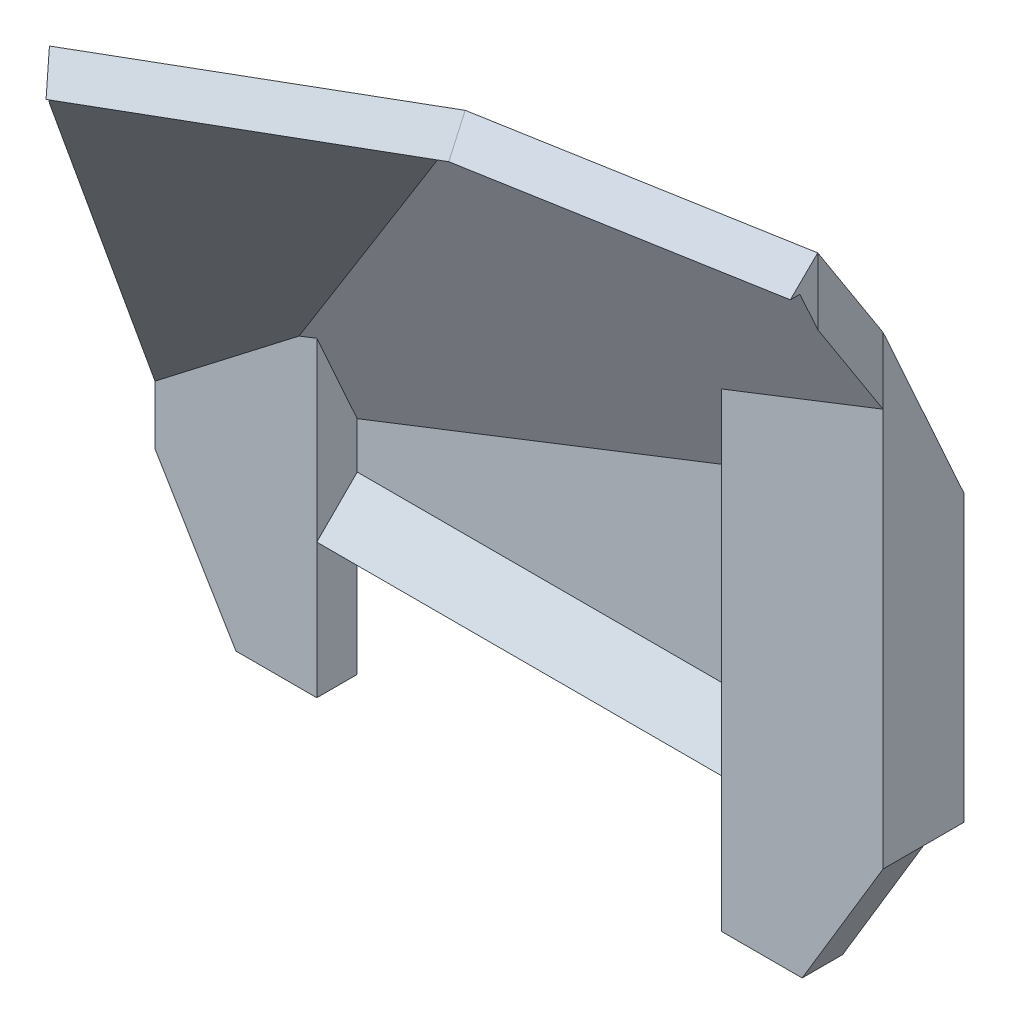
ISO-10303-21;
HEADER;
FILE_DESCRIPTION(('STEP AP214'),'2;1');
FILE_NAME('part.step','',(''),(''),'','','');
FILE_SCHEMA(('AUTOMOTIVE_DESIGN { 1 0 10303 214 1 1 1 1 }'));
ENDSEC;
DATA;
#1=APPLICATION_CONTEXT('core data for automotive mechanical design processes');
#2=APPLICATION_PROTOCOL_DEFINITION('international standard','automotive_design',2000,#1);
#3=PRODUCT_CONTEXT('',#1,'mechanical');
#4=PRODUCT('Part','Part','',(#3));
#5=PRODUCT_RELATED_PRODUCT_CATEGORY('part','',(#4));
#6=PRODUCT_DEFINITION_FORMATION('','',#4);
#7=PRODUCT_DEFINITION_CONTEXT('part definition',#1,'design');
#8=PRODUCT_DEFINITION('design','',#6,#7);
#9=PRODUCT_DEFINITION_SHAPE('','',#8);
#10=(LENGTH_UNIT() NAMED_UNIT(*) SI_UNIT(.MILLI.,.METRE.));
#11=(NAMED_UNIT(*) PLANE_ANGLE_UNIT() SI_UNIT($,.RADIAN.));
#12=(NAMED_UNIT(*) SI_UNIT($,.STERADIAN.) SOLID_ANGLE_UNIT());
#13=UNCERTAINTY_MEASURE_WITH_UNIT(LENGTH_MEASURE(1.E-05),#10,'distance_accuracy_value','');
#14=(GEOMETRIC_REPRESENTATION_CONTEXT(3) GLOBAL_UNCERTAINTY_ASSIGNED_CONTEXT((#13)) GLOBAL_UNIT_ASSIGNED_CONTEXT((#10,
#11,#12)) REPRESENTATION_CONTEXT('',''));
#15=CARTESIAN_POINT('',(0.,0.,0.));
#16=DIRECTION('',(0.,0.,1.));
#17=DIRECTION('',(1.,0.,0.));
#18=AXIS2_PLACEMENT_3D('',#15,#16,#17);
#19=CARTESIAN_POINT('',(-26.9999999999999,-10.,6.));
#20=DIRECTION('',(0.,0.,-1.));
#21=DIRECTION('',(1.,0.,0.));
#22=AXIS2_PLACEMENT_3D('',#19,#20,#21);
#23=PLANE('',#22);
#24=DIRECTION('',(0.,1.,0.));
#25=VECTOR('',#24,1.);
#26=CARTESIAN_POINT('',(-14.9999999999999,-10.,6.));
#27=LINE('',#26,#25);
#28=CARTESIAN_POINT('',(-14.9999999999999,-10.,6.));
#29=VERTEX_POINT('',#28);
#30=CARTESIAN_POINT('',(-14.9999999999999,0.,6.));
#31=VERTEX_POINT('',#30);
#32=EDGE_CURVE('E231',#29,#31,#27,.T.);
#33=ORIENTED_EDGE('',*,*,#32,.T.);
#34=CARTESIAN_POINT('',(-14.9999999999999,13.0901132346419,6.));
#35=VERTEX_POINT('',#34);
#36=EDGE_CURVE('E69',#31,#35,#27,.T.);
#37=ORIENTED_EDGE('',*,*,#36,.T.);
#38=DIRECTION('',(-0.931153923421058,-0.364626344217709,0.));
#39=VECTOR('',#38,1.);
#40=CARTESIAN_POINT('',(-16.267360264084,12.5938333734112,6.));
#41=LINE('',#40,#39);
#42=CARTESIAN_POINT('',(-16.3187220339688,12.5737208507503,6.));
#43=VERTEX_POINT('',#42);
#44=EDGE_CURVE('E223',#35,#43,#41,.T.);
#45=ORIENTED_EDGE('',*,*,#44,.T.);
#46=DIRECTION('',(-0.791909036541971,-0.610639073302034,0.));
#47=VECTOR('',#46,1.);
#48=CARTESIAN_POINT('',(-9.75365482953572,17.6360277179458,6.));
#49=LINE('',#48,#47);
#50=CARTESIAN_POINT('',(-26.9999999999999,4.33741418181764,6.));
#51=VERTEX_POINT('',#50);
#52=EDGE_CURVE('E220',#43,#51,#49,.T.);
#53=ORIENTED_EDGE('',*,*,#52,.T.);
#54=DIRECTION('',(0.,1.,0.));
#55=VECTOR('',#54,1.);
#56=CARTESIAN_POINT('',(-26.9999999999999,-10.,6.));
#57=LINE('',#56,#55);
#58=CARTESIAN_POINT('',(-26.9999999999999,0.,6.));
#59=VERTEX_POINT('',#58);
#60=EDGE_CURVE('E235',#59,#51,#57,.T.);
#61=ORIENTED_EDGE('',*,*,#60,.F.);
#62=DIRECTION('',(0.514495755427529,-0.857492925712543,0.));
#63=VECTOR('',#62,1.);
#64=CARTESIAN_POINT('',(-20.9999999999999,-10.,6.));
#65=LINE('',#64,#63);
#66=CARTESIAN_POINT('',(-20.9999999999999,-10.,6.));
#67=VERTEX_POINT('',#66);
#68=EDGE_CURVE('E381',#59,#67,#65,.T.);
#69=ORIENTED_EDGE('',*,*,#68,.T.);
#70=DIRECTION('',(1.,0.,0.));
#71=VECTOR('',#70,1.);
#72=CARTESIAN_POINT('',(-26.9999999999999,-10.,6.));
#73=LINE('',#72,#71);
#74=EDGE_CURVE('E194',#67,#29,#73,.T.);
#75=ORIENTED_EDGE('',*,*,#74,.T.);
#76=EDGE_LOOP('',(#33,#37,#45,#53,#61,#69,#75));
#77=FACE_BOUND('',#76,.T.);
#78=ADVANCED_FACE('F48',(#77),#23,.F.);
#79=CARTESIAN_POINT('',(26.9999999999999,40.,3.));
#80=DIRECTION('',(0.,0.,1.));
#81=DIRECTION('',(-1.,0.,0.));
#82=AXIS2_PLACEMENT_3D('',#79,#80,#81);
#83=PLANE('',#82);
#84=DIRECTION('',(0.,1.,0.));
#85=VECTOR('',#84,1.);
#86=CARTESIAN_POINT('',(-14.9999999999999,-10.,3.00000000000002));
#87=LINE('',#86,#85);
#88=CARTESIAN_POINT('',(-14.9999999999999,3.,3.00000000000002));
#89=VERTEX_POINT('',#88);
#90=CARTESIAN_POINT('',(-14.9999999999999,6.42773861031095,3.00000000000002));
#91=VERTEX_POINT('',#90);
#92=EDGE_CURVE('E228',#89,#91,#87,.T.);
#93=ORIENTED_EDGE('',*,*,#92,.F.);
#94=DIRECTION('',(1.,0.,0.));
#95=VECTOR('',#94,1.);
#96=CARTESIAN_POINT('',(-14.9999999999999,3.,3.00000000000002));
#97=LINE('',#96,#95);
#98=CARTESIAN_POINT('',(14.9999999999999,3.,3.));
#99=VERTEX_POINT('',#98);
#100=EDGE_CURVE('E376',#89,#99,#97,.T.);
#101=ORIENTED_EDGE('',*,*,#100,.T.);
#102=DIRECTION('',(0.,1.,0.));
#103=VECTOR('',#102,1.);
#104=CARTESIAN_POINT('',(14.9999999999999,-10.,3.));
#105=LINE('',#104,#103);
#106=CARTESIAN_POINT('',(14.9999999999999,18.1753026288806,3.));
#107=VERTEX_POINT('',#106);
#108=EDGE_CURVE('E374',#99,#107,#105,.T.);
#109=ORIENTED_EDGE('',*,*,#108,.T.);
#110=DIRECTION('',(-0.931153923421058,-0.364626344217709,0.));
#111=VECTOR('',#110,1.);
#112=CARTESIAN_POINT('',(32.8145637527844,25.1512269005049,3.));
#113=LINE('',#112,#111);
#114=EDGE_CURVE('E240',#107,#91,#113,.T.);
#115=ORIENTED_EDGE('',*,*,#114,.T.);
#116=EDGE_LOOP('',(#93,#101,#109,#115));
#117=FACE_BOUND('',#116,.T.);
#118=ADVANCED_FACE('F372',(#117),#83,.T.);
#119=CARTESIAN_POINT('',(-14.9999999999999,-10.,6.));
#120=DIRECTION('',(-1.,0.,0.));
#121=DIRECTION('',(0.,0.,-1.));
#122=AXIS2_PLACEMENT_3D('',#119,#120,#121);
#123=PLANE('',#122);
#124=ORIENTED_EDGE('',*,*,#36,.F.);
#125=DIRECTION('',(0.,-0.707106781186547,0.707106781186549));
#126=VECTOR('',#125,1.);
#127=CARTESIAN_POINT('',(-14.9999999999999,-4.99999999999998,11.));
#128=LINE('',#127,#126);
#129=EDGE_CURVE('E58',#31,#89,#128,.F.);
#130=ORIENTED_EDGE('',*,*,#129,.T.);
#131=ORIENTED_EDGE('',*,*,#92,.T.);
#132=DIRECTION('',(0.,0.911822558426511,0.410584488192787));
#133=VECTOR('',#132,1.);
#134=CARTESIAN_POINT('',(-14.9999999999999,35.4652043032819,16.0752775085296));
#135=LINE('',#134,#133);
#136=EDGE_CURVE('E214',#91,#35,#135,.T.);
#137=ORIENTED_EDGE('',*,*,#136,.T.);
#138=EDGE_LOOP('',(#124,#130,#131,#137));
#139=FACE_BOUND('',#138,.T.);
#140=ADVANCED_FACE('F362',(#139),#123,.F.);
#141=CARTESIAN_POINT('',(14.9999999999999,-10.,6.));
#142=DIRECTION('',(1.,0.,0.));
#143=DIRECTION('',(0.,0.,1.));
#144=AXIS2_PLACEMENT_3D('',#141,#142,#143);
#145=PLANE('',#144);
#146=ORIENTED_EDGE('',*,*,#108,.F.);
#147=DIRECTION('',(0.,0.707106781186547,-0.707106781186549));
#148=VECTOR('',#147,1.);
#149=CARTESIAN_POINT('',(14.9999999999999,-4.99999999999999,11.));
#150=LINE('',#149,#148);
#151=CARTESIAN_POINT('',(14.9999999999999,0.,6.));
#152=VERTEX_POINT('',#151);
#153=EDGE_CURVE('E11',#99,#152,#150,.F.);
#154=ORIENTED_EDGE('',*,*,#153,.T.);
#155=DIRECTION('',(0.,1.,0.));
#156=VECTOR('',#155,1.);
#157=CARTESIAN_POINT('',(14.9999999999999,-10.,6.));
#158=LINE('',#157,#156);
#159=CARTESIAN_POINT('',(14.9999999999999,24.8376772532116,6.));
#160=VERTEX_POINT('',#159);
#161=EDGE_CURVE('E385',#152,#160,#158,.T.);
#162=ORIENTED_EDGE('',*,*,#161,.T.);
#163=DIRECTION('',(0.,-0.911822558426511,-0.410584488192787));
#164=VECTOR('',#163,1.);
#165=CARTESIAN_POINT('',(14.9999999999999,37.4456042043015,11.6772221596693));
#166=LINE('',#165,#164);
#167=EDGE_CURVE('E383',#160,#107,#166,.T.);
#168=ORIENTED_EDGE('',*,*,#167,.T.);
#169=EDGE_LOOP('',(#146,#154,#162,#168));
#170=FACE_BOUND('',#169,.T.);
#171=ADVANCED_FACE('F384',(#170),#145,.F.);
#172=CARTESIAN_POINT('',(-68.5666018009765,39.1892431409136,27.1974117448279));
#173=DIRECTION('',(0.158740301760192,-0.405378429543178,0.9002609874132));
#174=DIRECTION('',(0.,0.911822558426511,0.410584488192787));
#175=AXIS2_PLACEMENT_3D('',#172,#173,#174);
#176=PLANE('',#175);
#177=DIRECTION('',(-0.931153923421058,-0.364626344217708,0.));
#178=VECTOR('',#177,1.);
#179=CARTESIAN_POINT('',(30.553211707447,30.928088927465,5.99999999999999));
#180=LINE('',#179,#178);
#181=CARTESIAN_POINT('',(26.9999999999999,29.5367028606395,5.99999999999999));
#182=VERTEX_POINT('',#181);
#183=EDGE_CURVE('E388',#182,#160,#180,.T.);
#184=ORIENTED_EDGE('',*,*,#183,.F.);
#185=DIRECTION('',(0.306220177294454,-0.846642984334573,-0.435229663620027));
#186=VECTOR('',#185,1.);
#187=CARTESIAN_POINT('',(23.7209030087755,38.6028084553183,10.6605690489681));
#188=LINE('',#187,#186);
#189=CARTESIAN_POINT('',(25.0000000000001,35.0663383785522,8.84259298303172));
#190=VERTEX_POINT('',#189);
#191=EDGE_CURVE('E245',#190,#182,#188,.T.);
#192=ORIENTED_EDGE('',*,*,#191,.F.);
#193=DIRECTION('',(0.,0.911822558426511,0.410584488192787));
#194=VECTOR('',#193,1.);
#195=CARTESIAN_POINT('',(25.0000000000001,45.3658861057604,13.4803752939788));
#196=LINE('',#195,#194);
#197=CARTESIAN_POINT('',(25.0000000000001,38.,10.1635911797111));
#198=VERTEX_POINT('',#197);
#199=EDGE_CURVE('E286',#190,#198,#196,.T.);
#200=ORIENTED_EDGE('',*,*,#199,.T.);
#201=DIRECTION('',(-0.984807753012208,0.,0.173648177666931));
#202=VECTOR('',#201,1.);
#203=CARTESIAN_POINT('',(2.49191869617031,38.,14.1323731975561));
#204=LINE('',#203,#202);
#205=CARTESIAN_POINT('',(2.60395394690039,38.,14.1126183600619));
#206=VERTEX_POINT('',#205);
#207=EDGE_CURVE('E246',#198,#206,#204,.T.);
#208=ORIENTED_EDGE('',*,*,#207,.T.);
#209=DIRECTION('',(-0.57838095381008,-0.777166802467694,-0.247966194090812));
#210=VECTOR('',#209,1.);
#211=CARTESIAN_POINT('',(-18.7931726368977,9.24881734161099,4.93914193675981));
#212=LINE('',#211,#210);
#213=EDGE_CURVE('E250',#206,#43,#212,.T.);
#214=ORIENTED_EDGE('',*,*,#213,.T.);
#215=ORIENTED_EDGE('',*,*,#44,.F.);
#216=ORIENTED_EDGE('',*,*,#136,.F.);
#217=ORIENTED_EDGE('',*,*,#114,.F.);
#218=ORIENTED_EDGE('',*,*,#167,.F.);
#219=EDGE_LOOP('',(#184,#192,#200,#208,#214,#215,#216,#217,#218));
#220=FACE_BOUND('',#219,.T.);
#221=ADVANCED_FACE('F369',(#220),#176,.T.);
#222=CARTESIAN_POINT('',(78.8029820720992,38.9118802658655,-29.1981513095221));
#223=DIRECTION('',(0.419523199908774,-0.544059867067231,0.726635497195871));
#224=DIRECTION('',(0.,0.80048450387039,0.599353450864659));
#225=AXIS2_PLACEMENT_3D('',#222,#223,#224);
#226=PLANE('',#225);
#227=ORIENTED_EDGE('',*,*,#213,.F.);
#228=DIRECTION('',(-0.866025403784438,0.,0.5));
#229=VECTOR('',#228,1.);
#230=CARTESIAN_POINT('',(6.76193149358926,38.,11.7120089041967));
#231=LINE('',#230,#229);
#232=CARTESIAN_POINT('',(-16.0718327002262,38.,24.8950888081085));
#233=VERTEX_POINT('',#232);
#234=EDGE_CURVE('E256',#206,#233,#231,.T.);
#235=ORIENTED_EDGE('',*,*,#234,.T.);
#236=DIRECTION('',(0.353487007296803,0.835211960599206,0.421269410881423));
#237=VECTOR('',#236,1.);
#238=CARTESIAN_POINT('',(-15.3011029250095,39.8210647445677,25.8136087866426));
#239=LINE('',#238,#237);
#240=CARTESIAN_POINT('',(-16.7811946296247,36.323933961935,24.0497041802981));
#241=VERTEX_POINT('',#240);
#242=EDGE_CURVE('E255',#241,#233,#239,.T.);
#243=ORIENTED_EDGE('',*,*,#242,.F.);
#244=DIRECTION('',(0.268049211615745,0.839037548777303,0.473461309817342));
#245=VECTOR('',#244,1.);
#246=CARTESIAN_POINT('',(-18.9793648562301,29.4433042909546,20.1670270091299));
#247=LINE('',#246,#245);
#248=EDGE_CURVE('E260',#51,#241,#247,.T.);
#249=ORIENTED_EDGE('',*,*,#248,.F.);
#250=ORIENTED_EDGE('',*,*,#52,.F.);
#251=EDGE_LOOP('',(#227,#235,#243,#249,#250));
#252=FACE_BOUND('',#251,.T.);
#253=ADVANCED_FACE('F404',(#252),#226,.T.);
#254=CARTESIAN_POINT('',(-26.9999999999999,40.,0.));
#255=DIRECTION('',(1.,0.,0.));
#256=DIRECTION('',(0.,0.,1.));
#257=AXIS2_PLACEMENT_3D('',#254,#255,#256);
#258=PLANE('',#257);
#259=ORIENTED_EDGE('',*,*,#60,.T.);
#260=DIRECTION('',(0.,-1.,0.));
#261=VECTOR('',#260,1.);
#262=CARTESIAN_POINT('',(-26.9999999999999,40.,6.));
#263=LINE('',#262,#261);
#264=CARTESIAN_POINT('',(-26.9999999999999,8.01348021988262,6.));
#265=VERTEX_POINT('',#264);
#266=EDGE_CURVE('E323',#265,#51,#263,.T.);
#267=ORIENTED_EDGE('',*,*,#266,.F.);
#268=DIRECTION('',(0.,0.80048450387039,0.599353450864659));
#269=VECTOR('',#268,1.);
#270=CARTESIAN_POINT('',(-26.9999999999999,50.5246197084247,37.8297206622404));
#271=LINE('',#270,#269);
#272=CARTESIAN_POINT('',(-26.9999999999999,0.,0.));
#273=VERTEX_POINT('',#272);
#274=EDGE_CURVE('E290',#273,#265,#271,.T.);
#275=ORIENTED_EDGE('',*,*,#274,.F.);
#276=DIRECTION('',(0.,0.,-1.));
#277=VECTOR('',#276,1.);
#278=CARTESIAN_POINT('',(-26.9999999999999,0.,0.));
#279=LINE('',#278,#277);
#280=CARTESIAN_POINT('',(-26.9999999999999,0.,3.00000000000004));
#281=VERTEX_POINT('',#280);
#282=EDGE_CURVE('E312',#281,#273,#279,.T.);
#283=ORIENTED_EDGE('',*,*,#282,.F.);
#284=DIRECTION('',(0.,0.,-1.));
#285=VECTOR('',#284,1.);
#286=CARTESIAN_POINT('',(-26.9999999999999,0.,17.6619037896906));
#287=LINE('',#286,#285);
#288=EDGE_CURVE('E198',#59,#281,#287,.T.);
#289=ORIENTED_EDGE('',*,*,#288,.F.);
#290=EDGE_LOOP('',(#259,#267,#275,#283,#289));
#291=FACE_BOUND('',#290,.T.);
#292=ADVANCED_FACE('F411',(#291),#258,.F.);
#293=CARTESIAN_POINT('',(26.9999999999999,40.,5.99999999999999));
#294=DIRECTION('',(-1.,0.,0.));
#295=DIRECTION('',(0.,0.,-1.));
#296=AXIS2_PLACEMENT_3D('',#293,#294,#295);
#297=PLANE('',#296);
#298=DIRECTION('',(0.,0.,1.));
#299=VECTOR('',#298,1.);
#300=CARTESIAN_POINT('',(26.9999999999999,0.,5.99999999999999));
#301=LINE('',#300,#299);
#302=CARTESIAN_POINT('',(26.9999999999999,0.,0.));
#303=VERTEX_POINT('',#302);
#304=CARTESIAN_POINT('',(26.9999999999999,0.,3.00000000000002));
#305=VERTEX_POINT('',#304);
#306=EDGE_CURVE('E319',#303,#305,#301,.T.);
#307=ORIENTED_EDGE('',*,*,#306,.F.);
#308=DIRECTION('',(0.,-1.,0.));
#309=VECTOR('',#308,1.);
#310=CARTESIAN_POINT('',(26.9999999999999,40.,0.));
#311=LINE('',#310,#309);
#312=CARTESIAN_POINT('',(26.9999999999999,21.1456152334255,0.));
#313=VERTEX_POINT('',#312);
#314=EDGE_CURVE('E336',#313,#303,#311,.T.);
#315=ORIENTED_EDGE('',*,*,#314,.F.);
#316=DIRECTION('',(0.,-0.911822558426511,-0.410584488192787));
#317=VECTOR('',#316,1.);
#318=CARTESIAN_POINT('',(26.9999999999999,37.0317603412936,7.15337068401348));
#319=LINE('',#318,#317);
#320=CARTESIAN_POINT('',(26.9999999999999,34.4703644820874,5.99999999999999));
#321=VERTEX_POINT('',#320);
#322=EDGE_CURVE('E301',#321,#313,#319,.T.);
#323=ORIENTED_EDGE('',*,*,#322,.F.);
#324=DIRECTION('',(0.,-1.,0.));
#325=VECTOR('',#324,1.);
#326=CARTESIAN_POINT('',(26.9999999999999,40.,5.99999999999999));
#327=LINE('',#326,#325);
#328=EDGE_CURVE('E332',#321,#182,#327,.T.);
#329=ORIENTED_EDGE('',*,*,#328,.T.);
#330=DIRECTION('',(0.,1.,0.));
#331=VECTOR('',#330,1.);
#332=CARTESIAN_POINT('',(26.9999999999999,-10.,5.99999999999999));
#333=LINE('',#332,#331);
#334=CARTESIAN_POINT('',(26.9999999999999,0.,5.99999999999998));
#335=VERTEX_POINT('',#334);
#336=EDGE_CURVE('E438',#335,#182,#333,.T.);
#337=ORIENTED_EDGE('',*,*,#336,.F.);
#338=DIRECTION('',(0.,0.,-1.));
#339=VECTOR('',#338,1.);
#340=CARTESIAN_POINT('',(26.9999999999999,0.,17.6619037896906));
#341=LINE('',#340,#339);
#342=EDGE_CURVE('E418',#335,#305,#341,.T.);
#343=ORIENTED_EDGE('',*,*,#342,.T.);
#344=EDGE_LOOP('',(#307,#315,#323,#329,#337,#343));
#345=FACE_BOUND('',#344,.T.);
#346=ADVANCED_FACE('F819',(#345),#297,.F.);
#347=CARTESIAN_POINT('',(25.0000000000001,40.,8.84259298303171));
#348=DIRECTION('',(-0.817852890807154,0.,-0.575427362052224));
#349=DIRECTION('',(0.575427362052224,0.,-0.817852890807154));
#350=AXIS2_PLACEMENT_3D('',#347,#348,#349);
#351=PLANE('',#350);
#352=ORIENTED_EDGE('',*,*,#191,.T.);
#353=ORIENTED_EDGE('',*,*,#328,.F.);
#354=DIRECTION('',(0.306220177294454,-0.846642984334573,-0.435229663620027));
#355=VECTOR('',#354,1.);
#356=CARTESIAN_POINT('',(25.0000000000002,40.,8.8425929830317));
#357=LINE('',#356,#355);
#358=CARTESIAN_POINT('',(25.0000000000001,40.,8.84259298303171));
#359=VERTEX_POINT('',#358);
#360=EDGE_CURVE('E305',#359,#321,#357,.T.);
#361=ORIENTED_EDGE('',*,*,#360,.F.);
#362=DIRECTION('',(0.,-1.,0.));
#363=VECTOR('',#362,1.);
#364=CARTESIAN_POINT('',(25.0000000000001,40.,8.84259298303171));
#365=LINE('',#364,#363);
#366=EDGE_CURVE('E329',#359,#190,#365,.T.);
#367=ORIENTED_EDGE('',*,*,#366,.T.);
#368=EDGE_LOOP('',(#352,#353,#361,#367));
#369=FACE_BOUND('',#368,.T.);
#370=ADVANCED_FACE('F807',(#369),#351,.F.);
#371=CARTESIAN_POINT('',(-15.4757873402926,40.,25.6054280071586));
#372=DIRECTION('',(0.76604444311904,0.,-0.642787609686466));
#373=DIRECTION('',(0.642787609686466,0.,0.76604444311904));
#374=AXIS2_PLACEMENT_3D('',#371,#372,#373);
#375=PLANE('',#374);
#376=DIRECTION('',(0.,-1.,0.));
#377=VECTOR('',#376,1.);
#378=CARTESIAN_POINT('',(-16.7811946296247,40.,24.0497041802981));
#379=LINE('',#378,#377);
#380=CARTESIAN_POINT('',(-16.7811946296248,40.,24.0497041802981));
#381=VERTEX_POINT('',#380);
#382=EDGE_CURVE('E326',#381,#241,#379,.T.);
#383=ORIENTED_EDGE('',*,*,#382,.T.);
#384=ORIENTED_EDGE('',*,*,#242,.T.);
#385=DIRECTION('',(-0.642787609686466,0.,-0.76604444311904));
#386=VECTOR('',#385,1.);
#387=CARTESIAN_POINT('',(-15.4757873402926,38.,25.6054280071586));
#388=LINE('',#387,#386);
#389=CARTESIAN_POINT('',(-15.4757873402926,38.,25.6054280071586));
#390=VERTEX_POINT('',#389);
#391=EDGE_CURVE('E251',#390,#233,#388,.T.);
#392=ORIENTED_EDGE('',*,*,#391,.F.);
#393=DIRECTION('',(0.457985074797283,-0.701673843159871,0.545805358244296));
#394=VECTOR('',#393,1.);
#395=CARTESIAN_POINT('',(-15.2763302445396,37.6944140003154,25.8431317175907));
#396=LINE('',#395,#394);
#397=EDGE_CURVE('E347',#381,#390,#396,.T.);
#398=ORIENTED_EDGE('',*,*,#397,.F.);
#399=EDGE_LOOP('',(#383,#384,#392,#398));
#400=FACE_BOUND('',#399,.T.);
#401=ADVANCED_FACE('F796',(#400),#375,.F.);
#402=CARTESIAN_POINT('',(-26.9999999999999,40.,6.));
#403=DIRECTION('',(0.870215688047314,0.,-0.492670941173051));
#404=DIRECTION('',(0.492670941173051,0.,0.870215688047314));
#405=AXIS2_PLACEMENT_3D('',#402,#403,#404);
#406=PLANE('',#405);
#407=ORIENTED_EDGE('',*,*,#248,.T.);
#408=ORIENTED_EDGE('',*,*,#382,.F.);
#409=DIRECTION('',(0.268049211615745,0.839037548777303,0.473461309817342));
#410=VECTOR('',#409,1.);
#411=CARTESIAN_POINT('',(-19.8061244357525,30.5314786249206,18.7067030967214));
#412=LINE('',#411,#410);
#413=EDGE_CURVE('E297',#265,#381,#412,.T.);
#414=ORIENTED_EDGE('',*,*,#413,.F.);
#415=ORIENTED_EDGE('',*,*,#266,.T.);
#416=EDGE_LOOP('',(#407,#408,#414,#415));
#417=FACE_BOUND('',#416,.T.);
#418=ADVANCED_FACE('F407',(#417),#406,.F.);
#419=CARTESIAN_POINT('',(26.9999999999999,40.,0.));
#420=DIRECTION('',(0.,0.,1.));
#421=DIRECTION('',(-1.,0.,0.));
#422=AXIS2_PLACEMENT_3D('',#419,#420,#421);
#423=PLANE('',#422);
#424=ORIENTED_EDGE('',*,*,#314,.T.);
#425=DIRECTION('',(1.,0.,0.));
#426=VECTOR('',#425,1.);
#427=CARTESIAN_POINT('',(26.9999999999999,0.,0.));
#428=LINE('',#427,#426);
#429=EDGE_CURVE('E316',#273,#303,#428,.T.);
#430=ORIENTED_EDGE('',*,*,#429,.F.);
#431=DIRECTION('',(-0.931153923421058,-0.364626344217709,0.));
#432=VECTOR('',#431,1.);
#433=CARTESIAN_POINT('',(33.4015020115709,23.6523503899566,0.));
#434=LINE('',#433,#432);
#435=EDGE_CURVE('E308',#313,#273,#434,.T.);
#436=ORIENTED_EDGE('',*,*,#435,.F.);
#437=EDGE_LOOP('',(#424,#430,#436));
#438=FACE_BOUND('',#437,.T.);
#439=ADVANCED_FACE('F773',(#438),#423,.F.);
#440=CARTESIAN_POINT('',(25.0000000000001,40.,10.8734462068032));
#441=DIRECTION('',(-1.,0.,0.));
#442=DIRECTION('',(0.,0.,-1.));
#443=AXIS2_PLACEMENT_3D('',#440,#441,#442);
#444=PLANE('',#443);
#445=DIRECTION('',(0.,0.,1.));
#446=VECTOR('',#445,1.);
#447=CARTESIAN_POINT('',(25.0000000000001,38.,10.8734462068032));
#448=LINE('',#447,#446);
#449=CARTESIAN_POINT('',(25.0000000000001,38.,10.8734462068032));
#450=VERTEX_POINT('',#449);
#451=EDGE_CURVE('E264',#198,#450,#448,.T.);
#452=ORIENTED_EDGE('',*,*,#451,.F.);
#453=ORIENTED_EDGE('',*,*,#199,.F.);
#454=ORIENTED_EDGE('',*,*,#366,.F.);
#455=DIRECTION('',(0.,0.701673843159864,-0.712498293208669));
#456=VECTOR('',#455,1.);
#457=CARTESIAN_POINT('',(25.0000000000001,37.9959273484217,10.8775816855967));
#458=LINE('',#457,#456);
#459=EDGE_CURVE('E351',#450,#359,#458,.T.);
#460=ORIENTED_EDGE('',*,*,#459,.F.);
#461=EDGE_LOOP('',(#452,#453,#454,#460));
#462=FACE_BOUND('',#461,.T.);
#463=ADVANCED_FACE('F615',(#462),#444,.F.);
#464=CARTESIAN_POINT('',(0.,0.,0.));
#465=DIRECTION('',(0.,1.,0.));
#466=DIRECTION('',(0.,0.,-1.));
#467=AXIS2_PLACEMENT_3D('',#464,#465,#466);
#468=PLANE('',#467);
#469=ORIENTED_EDGE('',*,*,#282,.T.);
#470=ORIENTED_EDGE('',*,*,#429,.T.);
#471=ORIENTED_EDGE('',*,*,#306,.T.);
#472=DIRECTION('',(1.,0.,0.));
#473=VECTOR('',#472,1.);
#474=CARTESIAN_POINT('',(26.9999999999999,0.,3.));
#475=LINE('',#474,#473);
#476=CARTESIAN_POINT('',(14.9999999999999,0.,3.));
#477=VERTEX_POINT('',#476);
#478=EDGE_CURVE('E244',#477,#305,#475,.T.);
#479=ORIENTED_EDGE('',*,*,#478,.F.);
#480=DIRECTION('',(0.,0.,1.));
#481=VECTOR('',#480,1.);
#482=CARTESIAN_POINT('',(14.9999999999999,0.,3.));
#483=LINE('',#482,#481);
#484=EDGE_CURVE('E461',#477,#152,#483,.T.);
#485=ORIENTED_EDGE('',*,*,#484,.T.);
#486=DIRECTION('',(-1.,0.,0.));
#487=VECTOR('',#486,1.);
#488=CARTESIAN_POINT('',(14.9999999999999,0.,6.));
#489=LINE('',#488,#487);
#490=EDGE_CURVE('E473',#152,#31,#489,.T.);
#491=ORIENTED_EDGE('',*,*,#490,.T.);
#492=DIRECTION('',(0.,0.,-1.));
#493=VECTOR('',#492,1.);
#494=CARTESIAN_POINT('',(-14.9999999999999,0.,6.));
#495=LINE('',#494,#493);
#496=CARTESIAN_POINT('',(-14.9999999999999,0.,3.00000000000002));
#497=VERTEX_POINT('',#496);
#498=EDGE_CURVE('E466',#31,#497,#495,.T.);
#499=ORIENTED_EDGE('',*,*,#498,.T.);
#500=EDGE_CURVE('E261',#281,#497,#475,.T.);
#501=ORIENTED_EDGE('',*,*,#500,.F.);
#502=EDGE_LOOP('',(#469,#470,#471,#479,#485,#491,#499,#501));
#503=FACE_BOUND('',#502,.T.);
#504=ADVANCED_FACE('F609',(#503),#468,.F.);
#505=CARTESIAN_POINT('',(-68.8840824044969,40.,25.3968897700015));
#506=DIRECTION('',(0.158740301760192,-0.405378429543178,0.9002609874132));
#507=DIRECTION('',(0.,0.911822558426511,0.410584488192787));
#508=AXIS2_PLACEMENT_3D('',#505,#506,#507);
#509=PLANE('',#508);
#510=DIRECTION('',(-0.984807753012208,0.,0.173648177666931));
#511=VECTOR('',#510,1.);
#512=CARTESIAN_POINT('',(2.26601469988969,40.,12.8512079704708));
#513=LINE('',#512,#511);
#514=CARTESIAN_POINT('',(2.7686906838316,40.,12.7625726319477));
#515=VERTEX_POINT('',#514);
#516=EDGE_CURVE('E340',#359,#515,#513,.T.);
#517=ORIENTED_EDGE('',*,*,#516,.F.);
#518=ORIENTED_EDGE('',*,*,#360,.T.);
#519=ORIENTED_EDGE('',*,*,#322,.T.);
#520=ORIENTED_EDGE('',*,*,#435,.T.);
#521=DIRECTION('',(-0.57838095381008,-0.777166802467694,-0.247966194090812));
#522=VECTOR('',#521,1.);
#523=CARTESIAN_POINT('',(-19.3889192265742,10.2269607410844,3.26305823155421));
#524=LINE('',#523,#522);
#525=EDGE_CURVE('E344',#515,#273,#524,.T.);
#526=ORIENTED_EDGE('',*,*,#525,.F.);
#527=EDGE_LOOP('',(#517,#518,#519,#520,#526));
#528=FACE_BOUND('',#527,.T.);
#529=ADVANCED_FACE('F614',(#528),#509,.F.);
#530=CARTESIAN_POINT('',(77.9639356722817,40.,-30.6514223039138));
#531=DIRECTION('',(0.419523199908774,-0.544059867067231,0.726635497195871));
#532=DIRECTION('',(0.,0.80048450387039,0.599353450864659));
#533=AXIS2_PLACEMENT_3D('',#530,#531,#532);
#534=PLANE('',#533);
#535=ORIENTED_EDGE('',*,*,#274,.T.);
#536=ORIENTED_EDGE('',*,*,#413,.T.);
#537=DIRECTION('',(-0.866025403784438,0.,0.5));
#538=VECTOR('',#537,1.);
#539=CARTESIAN_POINT('',(77.9639356722817,40.,-30.6514223039138));
#540=LINE('',#539,#538);
#541=EDGE_CURVE('E294',#515,#381,#540,.T.);
#542=ORIENTED_EDGE('',*,*,#541,.F.);
#543=ORIENTED_EDGE('',*,*,#525,.T.);
#544=EDGE_LOOP('',(#535,#536,#542,#543));
#545=FACE_BOUND('',#544,.T.);
#546=ADVANCED_FACE('F741',(#545),#534,.F.);
#547=CARTESIAN_POINT('',(0.,38.,0.));
#548=DIRECTION('',(0.,1.,0.));
#549=DIRECTION('',(0.,0.,-1.));
#550=AXIS2_PLACEMENT_3D('',#547,#548,#549);
#551=PLANE('',#550);
#552=ORIENTED_EDGE('',*,*,#234,.F.);
#553=ORIENTED_EDGE('',*,*,#207,.F.);
#554=ORIENTED_EDGE('',*,*,#451,.T.);
#555=DIRECTION('',(-0.984807753012208,0.,0.173648177666931));
#556=VECTOR('',#555,1.);
#557=CARTESIAN_POINT('',(25.0000000000001,38.,10.8734462068032));
#558=LINE('',#557,#556);
#559=CARTESIAN_POINT('',(3.46328339449937,38.,14.670950420225));
#560=VERTEX_POINT('',#559);
#561=EDGE_CURVE('E273',#450,#560,#558,.T.);
#562=ORIENTED_EDGE('',*,*,#561,.T.);
#563=DIRECTION('',(-0.866025403784438,0.,0.5));
#564=VECTOR('',#563,1.);
#565=CARTESIAN_POINT('',(-15.4757873402926,38.,25.6054280071586));
#566=LINE('',#565,#564);
#567=EDGE_CURVE('E270',#560,#390,#566,.T.);
#568=ORIENTED_EDGE('',*,*,#567,.T.);
#569=ORIENTED_EDGE('',*,*,#391,.T.);
#570=EDGE_LOOP('',(#552,#553,#554,#562,#568,#569));
#571=FACE_BOUND('',#570,.T.);
#572=ADVANCED_FACE('F730',(#571),#551,.F.);
#573=CARTESIAN_POINT('',(2.26601469988969,40.,12.8512079704708));
#574=DIRECTION('',(0.122787803968974,0.707106781186547,0.69636424032002));
#575=DIRECTION('',(0.984807753012208,0.,-0.173648177666931));
#576=AXIS2_PLACEMENT_3D('',#573,#574,#575);
#577=PLANE('',#576);
#578=ORIENTED_EDGE('',*,*,#459,.T.);
#579=ORIENTED_EDGE('',*,*,#516,.T.);
#580=DIRECTION('',(-0.243688768362522,0.701673843159864,-0.669529388450741));
#581=VECTOR('',#580,1.);
#582=CARTESIAN_POINT('',(2.64858663532448,40.3458258247246,12.4325894706891));
#583=LINE('',#582,#581);
#584=EDGE_CURVE('E239',#515,#560,#583,.F.);
#585=ORIENTED_EDGE('',*,*,#584,.T.);
#586=ORIENTED_EDGE('',*,*,#561,.F.);
#587=EDGE_LOOP('',(#578,#579,#585,#586));
#588=FACE_BOUND('',#587,.T.);
#589=ADVANCED_FACE('F511',(#588),#577,.T.);
#590=CARTESIAN_POINT('',(6.21852872941327,40.,10.7708077076705));
#591=DIRECTION('',(0.353553390593275,0.707106781186546,0.612372435695795));
#592=DIRECTION('',(0.866025403784438,0.,-0.5));
#593=AXIS2_PLACEMENT_3D('',#590,#591,#592);
#594=PLANE('',#593);
#595=ORIENTED_EDGE('',*,*,#584,.F.);
#596=ORIENTED_EDGE('',*,*,#541,.T.);
#597=ORIENTED_EDGE('',*,*,#397,.T.);
#598=ORIENTED_EDGE('',*,*,#567,.F.);
#599=EDGE_LOOP('',(#595,#596,#597,#598));
#600=FACE_BOUND('',#599,.T.);
#601=ADVANCED_FACE('F502',(#600),#594,.T.);
#602=CARTESIAN_POINT('',(-14.9999999999999,-10.,3.00000000000002));
#603=DIRECTION('',(0.,0.,1.));
#604=DIRECTION('',(-1.,0.,0.));
#605=AXIS2_PLACEMENT_3D('',#602,#603,#604);
#606=PLANE('',#605);
#607=CARTESIAN_POINT('',(-19.4999999999999,-4.5,3.00000000000003));
#608=DIRECTION('',(0.,0.,-1.));
#609=DIRECTION('',(-1.,0.,0.));
#610=AXIS2_PLACEMENT_3D('',#607,#608,#609);
#611=CIRCLE('',#610,2.);
#612=CARTESIAN_POINT('',(-21.4999999999999,-4.5,3.00000000000003));
#613=VERTEX_POINT('',#612);
#614=EDGE_CURVE('E484',#613,#613,#611,.T.);
#615=ORIENTED_EDGE('',*,*,#614,.F.);
#616=EDGE_LOOP('',(#615));
#617=FACE_BOUND('',#616,.T.);
#618=ORIENTED_EDGE('',*,*,#500,.T.);
#619=CARTESIAN_POINT('',(-14.9999999999999,-10.,3.00000000000002));
#620=VERTEX_POINT('',#619);
#621=EDGE_CURVE('E212',#620,#497,#87,.T.);
#622=ORIENTED_EDGE('',*,*,#621,.F.);
#623=DIRECTION('',(-1.,0.,0.));
#624=VECTOR('',#623,1.);
#625=CARTESIAN_POINT('',(-14.9999999999999,-10.,3.00000000000002));
#626=LINE('',#625,#624);
#627=CARTESIAN_POINT('',(-20.9999999999999,-10.,3.00000000000004));
#628=VERTEX_POINT('',#627);
#629=EDGE_CURVE('E191',#620,#628,#626,.T.);
#630=ORIENTED_EDGE('',*,*,#629,.T.);
#631=DIRECTION('',(-0.514495755427529,0.857492925712543,0.));
#632=VECTOR('',#631,1.);
#633=CARTESIAN_POINT('',(-20.9999999999999,-10.,3.00000000000004));
#634=LINE('',#633,#632);
#635=EDGE_CURVE('E199',#628,#281,#634,.T.);
#636=ORIENTED_EDGE('',*,*,#635,.T.);
#637=EDGE_LOOP('',(#618,#622,#630,#636));
#638=FACE_BOUND('',#637,.T.);
#639=ADVANCED_FACE('F211',(#617,#638),#606,.F.);
#640=ORIENTED_EDGE('',*,*,#161,.F.);
#641=CARTESIAN_POINT('',(14.9999999999999,-10.,6.));
#642=VERTEX_POINT('',#641);
#643=EDGE_CURVE('E434',#642,#152,#158,.T.);
#644=ORIENTED_EDGE('',*,*,#643,.F.);
#645=DIRECTION('',(1.,0.,0.));
#646=VECTOR('',#645,1.);
#647=CARTESIAN_POINT('',(26.9999999999999,-10.,5.99999999999999));
#648=LINE('',#647,#646);
#649=CARTESIAN_POINT('',(20.9999999999999,-10.,5.99999999999999));
#650=VERTEX_POINT('',#649);
#651=EDGE_CURVE('E441',#642,#650,#648,.T.);
#652=ORIENTED_EDGE('',*,*,#651,.T.);
#653=DIRECTION('',(0.514495755427527,0.857492925712544,0.));
#654=VECTOR('',#653,1.);
#655=CARTESIAN_POINT('',(20.9999999999999,-10.,5.99999999999999));
#656=LINE('',#655,#654);
#657=EDGE_CURVE('E425',#650,#335,#656,.T.);
#658=ORIENTED_EDGE('',*,*,#657,.T.);
#659=ORIENTED_EDGE('',*,*,#336,.T.);
#660=ORIENTED_EDGE('',*,*,#183,.T.);
#661=EDGE_LOOP('',(#640,#644,#652,#658,#659,#660));
#662=FACE_BOUND('',#661,.T.);
#663=ADVANCED_FACE('F501',(#662),#23,.F.);
#664=ORIENTED_EDGE('',*,*,#621,.T.);
#665=ORIENTED_EDGE('',*,*,#498,.F.);
#666=ORIENTED_EDGE('',*,*,#32,.F.);
#667=DIRECTION('',(0.,0.,-1.));
#668=VECTOR('',#667,1.);
#669=CARTESIAN_POINT('',(-14.9999999999999,-10.,6.));
#670=LINE('',#669,#668);
#671=EDGE_CURVE('E218',#29,#620,#670,.T.);
#672=ORIENTED_EDGE('',*,*,#671,.T.);
#673=EDGE_LOOP('',(#664,#665,#666,#672));
#674=FACE_BOUND('',#673,.T.);
#675=ADVANCED_FACE('F508',(#674),#123,.F.);
#676=CARTESIAN_POINT('',(0.,-10.,0.));
#677=DIRECTION('',(0.,-1.,0.));
#678=DIRECTION('',(0.,0.,1.));
#679=AXIS2_PLACEMENT_3D('',#676,#677,#678);
#680=PLANE('',#679);
#681=DIRECTION('',(0.,0.,-1.));
#682=VECTOR('',#681,1.);
#683=CARTESIAN_POINT('',(-20.9999999999999,-10.,17.6619037896906));
#684=LINE('',#683,#682);
#685=EDGE_CURVE('E187',#67,#628,#684,.T.);
#686=ORIENTED_EDGE('',*,*,#685,.T.);
#687=ORIENTED_EDGE('',*,*,#629,.F.);
#688=ORIENTED_EDGE('',*,*,#671,.F.);
#689=ORIENTED_EDGE('',*,*,#74,.F.);
#690=EDGE_LOOP('',(#686,#687,#688,#689));
#691=FACE_BOUND('',#690,.T.);
#692=ADVANCED_FACE('F189',(#691),#680,.T.);
#693=CARTESIAN_POINT('',(14.9999999999999,-10.,3.));
#694=DIRECTION('',(0.,0.,1.));
#695=DIRECTION('',(-1.,0.,0.));
#696=AXIS2_PLACEMENT_3D('',#693,#694,#695);
#697=PLANE('',#696);
#698=CARTESIAN_POINT('',(19.4999999999999,-4.5,3.));
#699=DIRECTION('',(0.,0.,-1.));
#700=DIRECTION('',(-1.,0.,0.));
#701=AXIS2_PLACEMENT_3D('',#698,#699,#700);
#702=CIRCLE('',#701,2.);
#703=CARTESIAN_POINT('',(17.4999999999999,-4.5,3.));
#704=VERTEX_POINT('',#703);
#705=EDGE_CURVE('E480',#704,#704,#702,.T.);
#706=ORIENTED_EDGE('',*,*,#705,.F.);
#707=EDGE_LOOP('',(#706));
#708=FACE_BOUND('',#707,.T.);
#709=DIRECTION('',(-1.,0.,0.));
#710=VECTOR('',#709,1.);
#711=CARTESIAN_POINT('',(14.9999999999999,-10.,3.));
#712=LINE('',#711,#710);
#713=CARTESIAN_POINT('',(20.9999999999999,-10.,3.));
#714=VERTEX_POINT('',#713);
#715=CARTESIAN_POINT('',(14.9999999999999,-10.,3.));
#716=VERTEX_POINT('',#715);
#717=EDGE_CURVE('E392',#714,#716,#712,.T.);
#718=ORIENTED_EDGE('',*,*,#717,.T.);
#719=EDGE_CURVE('E380',#716,#477,#105,.T.);
#720=ORIENTED_EDGE('',*,*,#719,.T.);
#721=ORIENTED_EDGE('',*,*,#478,.T.);
#722=DIRECTION('',(-0.514495755427527,-0.857492925712544,0.));
#723=VECTOR('',#722,1.);
#724=CARTESIAN_POINT('',(20.9999999999999,-10.,3.00000000000002));
#725=LINE('',#724,#723);
#726=EDGE_CURVE('E209',#305,#714,#725,.T.);
#727=ORIENTED_EDGE('',*,*,#726,.T.);
#728=EDGE_LOOP('',(#718,#720,#721,#727));
#729=FACE_BOUND('',#728,.T.);
#730=ADVANCED_FACE('F453',(#708,#729),#697,.F.);
#731=ORIENTED_EDGE('',*,*,#643,.T.);
#732=ORIENTED_EDGE('',*,*,#484,.F.);
#733=ORIENTED_EDGE('',*,*,#719,.F.);
#734=DIRECTION('',(0.,0.,1.));
#735=VECTOR('',#734,1.);
#736=CARTESIAN_POINT('',(14.9999999999999,-10.,6.));
#737=LINE('',#736,#735);
#738=EDGE_CURVE('E444',#716,#642,#737,.T.);
#739=ORIENTED_EDGE('',*,*,#738,.T.);
#740=EDGE_LOOP('',(#731,#732,#733,#739));
#741=FACE_BOUND('',#740,.T.);
#742=ADVANCED_FACE('F459',(#741),#145,.F.);
#743=CARTESIAN_POINT('',(0.,-10.,0.));
#744=DIRECTION('',(0.,1.,0.));
#745=DIRECTION('',(0.,0.,-1.));
#746=AXIS2_PLACEMENT_3D('',#743,#744,#745);
#747=PLANE('',#746);
#748=ORIENTED_EDGE('',*,*,#651,.F.);
#749=ORIENTED_EDGE('',*,*,#738,.F.);
#750=ORIENTED_EDGE('',*,*,#717,.F.);
#751=DIRECTION('',(0.,0.,-1.));
#752=VECTOR('',#751,1.);
#753=CARTESIAN_POINT('',(20.9999999999999,-10.,17.6619037896906));
#754=LINE('',#753,#752);
#755=EDGE_CURVE('E422',#650,#714,#754,.T.);
#756=ORIENTED_EDGE('',*,*,#755,.F.);
#757=EDGE_LOOP('',(#748,#749,#750,#756));
#758=FACE_BOUND('',#757,.T.);
#759=ADVANCED_FACE('F456',(#758),#747,.F.);
#760=CARTESIAN_POINT('',(20.9999999999999,-10.,17.6619037896906));
#761=DIRECTION('',(-0.857492925712544,0.514495755427527,0.));
#762=DIRECTION('',(-0.514495755427527,-0.857492925712544,0.));
#763=AXIS2_PLACEMENT_3D('',#760,#761,#762);
#764=PLANE('',#763);
#765=ORIENTED_EDGE('',*,*,#657,.F.);
#766=ORIENTED_EDGE('',*,*,#755,.T.);
#767=ORIENTED_EDGE('',*,*,#726,.F.);
#768=ORIENTED_EDGE('',*,*,#342,.F.);
#769=EDGE_LOOP('',(#765,#766,#767,#768));
#770=FACE_BOUND('',#769,.T.);
#771=ADVANCED_FACE('F527',(#770),#764,.F.);
#772=CARTESIAN_POINT('',(-20.9999999999999,-10.,17.6619037896906));
#773=DIRECTION('',(0.857492925712543,0.514495755427529,0.));
#774=DIRECTION('',(-0.514495755427529,0.857492925712543,0.));
#775=AXIS2_PLACEMENT_3D('',#772,#773,#774);
#776=PLANE('',#775);
#777=ORIENTED_EDGE('',*,*,#68,.F.);
#778=ORIENTED_EDGE('',*,*,#288,.T.);
#779=ORIENTED_EDGE('',*,*,#635,.F.);
#780=ORIENTED_EDGE('',*,*,#685,.F.);
#781=EDGE_LOOP('',(#777,#778,#779,#780));
#782=FACE_BOUND('',#781,.T.);
#783=ADVANCED_FACE('F202',(#782),#776,.F.);
#784=CARTESIAN_POINT('',(19.4999999999999,-4.5,5.));
#785=DIRECTION('',(0.,0.,-1.));
#786=DIRECTION('',(-1.,0.,0.));
#787=AXIS2_PLACEMENT_3D('',#784,#785,#786);
#788=CYLINDRICAL_SURFACE('',#787,2.);
#789=CARTESIAN_POINT('',(19.4999999999999,-4.5,5.));
#790=DIRECTION('',(0.,0.,-1.));
#791=DIRECTION('',(-1.,0.,0.));
#792=AXIS2_PLACEMENT_3D('',#789,#790,#791);
#793=CIRCLE('',#792,2.);
#794=CARTESIAN_POINT('',(17.4999999999999,-4.5,5.));
#795=VERTEX_POINT('',#794);
#796=EDGE_CURVE('E430',#795,#795,#793,.T.);
#797=ORIENTED_EDGE('',*,*,#796,.F.);
#798=EDGE_LOOP('',(#797));
#799=FACE_BOUND('',#798,.T.);
#800=ORIENTED_EDGE('',*,*,#705,.T.);
#801=EDGE_LOOP('',(#800));
#802=FACE_BOUND('',#801,.T.);
#803=ADVANCED_FACE('F538',(#799,#802),#788,.F.);
#804=CARTESIAN_POINT('',(19.4999999999999,-4.5,5.));
#805=DIRECTION('',(0.,0.,-1.));
#806=DIRECTION('',(-1.,0.,0.));
#807=AXIS2_PLACEMENT_3D('',#804,#805,#806);
#808=PLANE('',#807);
#809=ORIENTED_EDGE('',*,*,#796,.T.);
#810=EDGE_LOOP('',(#809));
#811=FACE_BOUND('',#810,.T.);
#812=ADVANCED_FACE('F496',(#811),#808,.T.);
#813=CARTESIAN_POINT('',(-19.4999999999999,-4.5,5.00000000000003));
#814=DIRECTION('',(0.,0.,-1.));
#815=DIRECTION('',(-1.,0.,0.));
#816=AXIS2_PLACEMENT_3D('',#813,#814,#815);
#817=CYLINDRICAL_SURFACE('',#816,2.);
#818=CARTESIAN_POINT('',(-19.4999999999999,-4.5,5.00000000000003));
#819=DIRECTION('',(0.,0.,-1.));
#820=DIRECTION('',(-1.,0.,0.));
#821=AXIS2_PLACEMENT_3D('',#818,#819,#820);
#822=CIRCLE('',#821,2.);
#823=CARTESIAN_POINT('',(-21.4999999999999,-4.5,5.00000000000003));
#824=VERTEX_POINT('',#823);
#825=EDGE_CURVE('E470',#824,#824,#822,.T.);
#826=ORIENTED_EDGE('',*,*,#825,.F.);
#827=EDGE_LOOP('',(#826));
#828=FACE_BOUND('',#827,.T.);
#829=ORIENTED_EDGE('',*,*,#614,.T.);
#830=EDGE_LOOP('',(#829));
#831=FACE_BOUND('',#830,.T.);
#832=ADVANCED_FACE('F493',(#828,#831),#817,.F.);
#833=CARTESIAN_POINT('',(-19.4999999999999,-4.5,5.00000000000003));
#834=DIRECTION('',(0.,0.,-1.));
#835=DIRECTION('',(-1.,0.,0.));
#836=AXIS2_PLACEMENT_3D('',#833,#834,#835);
#837=PLANE('',#836);
#838=ORIENTED_EDGE('',*,*,#825,.T.);
#839=EDGE_LOOP('',(#838));
#840=FACE_BOUND('',#839,.T.);
#841=ADVANCED_FACE('F491',(#840),#837,.T.);
#842=CARTESIAN_POINT('',(-26.9999999999999,0.,6.));
#843=DIRECTION('',(0.,-0.707106781186549,-0.707106781186547));
#844=DIRECTION('',(-1.,0.,0.));
#845=AXIS2_PLACEMENT_3D('',#842,#843,#844);
#846=PLANE('',#845);
#847=ORIENTED_EDGE('',*,*,#153,.F.);
#848=ORIENTED_EDGE('',*,*,#100,.F.);
#849=ORIENTED_EDGE('',*,*,#129,.F.);
#850=ORIENTED_EDGE('',*,*,#490,.F.);
#851=EDGE_LOOP('',(#847,#848,#849,#850));
#852=FACE_BOUND('',#851,.T.);
#853=ADVANCED_FACE('F51',(#852),#846,.F.);
#854=CLOSED_SHELL('',(#78,#118,#140,#171,#221,#253,#292,#346,#370,#401,#418,#439,#463,#504,#529,
#546,#572,#589,#601,#639,#663,#675,#692,#730,#742,#759,#771,#783,#803,#812,#832,#841,#853));
#855=MANIFOLD_SOLID_BREP('B2',#854);
#856=ADVANCED_BREP_SHAPE_REPRESENTATION('',(#18,#855),#14);
#857=SHAPE_DEFINITION_REPRESENTATION(#9,#856);
ENDSEC;
END-ISO-10303-21;
